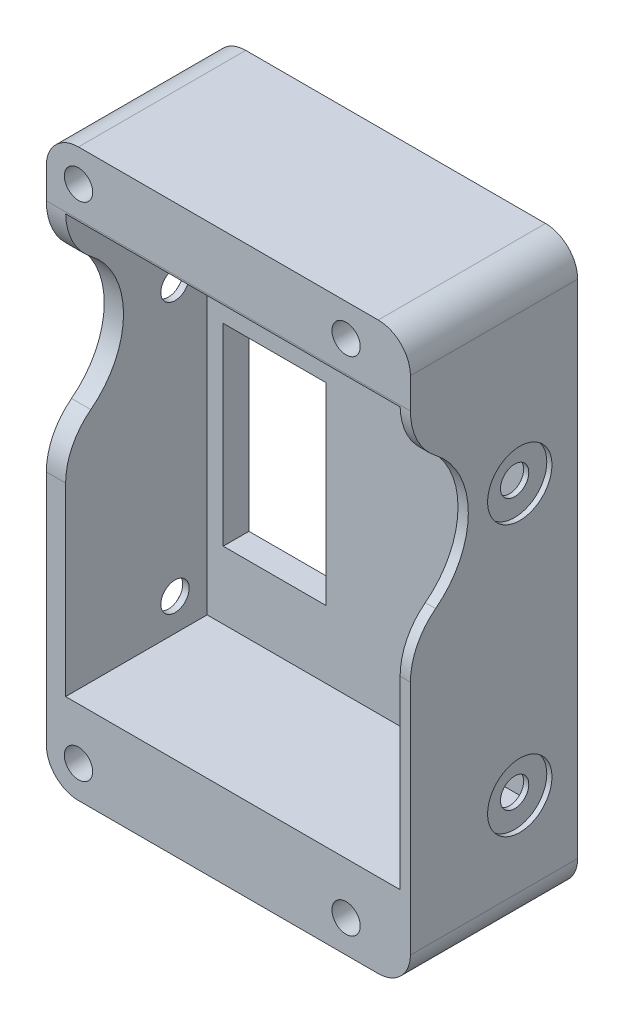
ISO-10303-21;
HEADER;
FILE_DESCRIPTION(('STEP AP214'),'2;1');
FILE_NAME('part.step','',(''),(''),'','','');
FILE_SCHEMA(('AUTOMOTIVE_DESIGN { 1 0 10303 214 1 1 1 1 }'));
ENDSEC;
DATA;
#1=APPLICATION_CONTEXT('core data for automotive mechanical design processes');
#2=APPLICATION_PROTOCOL_DEFINITION('international standard','automotive_design',2000,#1);
#3=PRODUCT_CONTEXT('',#1,'mechanical');
#4=PRODUCT('Part','Part','',(#3));
#5=PRODUCT_RELATED_PRODUCT_CATEGORY('part','',(#4));
#6=PRODUCT_DEFINITION_FORMATION('','',#4);
#7=PRODUCT_DEFINITION_CONTEXT('part definition',#1,'design');
#8=PRODUCT_DEFINITION('design','',#6,#7);
#9=PRODUCT_DEFINITION_SHAPE('','',#8);
#10=(LENGTH_UNIT() NAMED_UNIT(*) SI_UNIT(.MILLI.,.METRE.));
#11=(NAMED_UNIT(*) PLANE_ANGLE_UNIT() SI_UNIT($,.RADIAN.));
#12=(NAMED_UNIT(*) SI_UNIT($,.STERADIAN.) SOLID_ANGLE_UNIT());
#13=UNCERTAINTY_MEASURE_WITH_UNIT(LENGTH_MEASURE(1.E-05),#10,'distance_accuracy_value','');
#14=(GEOMETRIC_REPRESENTATION_CONTEXT(3) GLOBAL_UNCERTAINTY_ASSIGNED_CONTEXT((#13)) GLOBAL_UNIT_ASSIGNED_CONTEXT((#10,
#11,#12)) REPRESENTATION_CONTEXT('',''));
#15=CARTESIAN_POINT('',(0.,0.,0.));
#16=DIRECTION('',(0.,0.,1.));
#17=DIRECTION('',(1.,0.,0.));
#18=AXIS2_PLACEMENT_3D('',#15,#16,#17);
#19=CARTESIAN_POINT('',(26.8,2.5,2.50000000000001));
#20=DIRECTION('',(-1.,0.,0.));
#21=DIRECTION('',(0.,-1.,0.));
#22=AXIS2_PLACEMENT_3D('',#19,#20,#21);
#23=CYLINDRICAL_SURFACE('',#22,1.1);
#24=CARTESIAN_POINT('',(0.,2.5,2.50000000000001));
#25=DIRECTION('',(1.,0.,0.));
#26=DIRECTION('',(0.,0.,-1.));
#27=AXIS2_PLACEMENT_3D('',#24,#25,#26);
#28=CIRCLE('',#27,1.1);
#29=CARTESIAN_POINT('',(0.,2.5,1.40000000000001));
#30=VERTEX_POINT('',#29);
#31=EDGE_CURVE('E233',#30,#30,#28,.T.);
#32=ORIENTED_EDGE('',*,*,#31,.T.);
#33=EDGE_LOOP('',(#32));
#34=FACE_BOUND('',#33,.T.);
#35=CARTESIAN_POINT('',(-0.5,2.5,2.50000000000001));
#36=DIRECTION('',(-1.,0.,0.));
#37=DIRECTION('',(0.,0.,1.));
#38=AXIS2_PLACEMENT_3D('',#35,#36,#37);
#39=CIRCLE('',#38,1.1);
#40=CARTESIAN_POINT('',(-0.5,2.5,3.6));
#41=VERTEX_POINT('',#40);
#42=EDGE_CURVE('E37',#41,#41,#39,.F.);
#43=ORIENTED_EDGE('',*,*,#42,.F.);
#44=EDGE_LOOP('',(#43));
#45=FACE_BOUND('',#44,.T.);
#46=ADVANCED_FACE('F33',(#34,#45),#23,.F.);
#47=CARTESIAN_POINT('',(26.8,23.5,2.5));
#48=DIRECTION('',(-1.,0.,0.));
#49=DIRECTION('',(0.,-1.,0.));
#50=AXIS2_PLACEMENT_3D('',#47,#48,#49);
#51=CYLINDRICAL_SURFACE('',#50,1.1);
#52=CARTESIAN_POINT('',(0.,23.5,2.5));
#53=DIRECTION('',(1.,0.,0.));
#54=DIRECTION('',(0.,0.,-1.));
#55=AXIS2_PLACEMENT_3D('',#52,#53,#54);
#56=CIRCLE('',#55,1.1);
#57=CARTESIAN_POINT('',(0.,23.5,1.4));
#58=VERTEX_POINT('',#57);
#59=EDGE_CURVE('E237',#58,#58,#56,.T.);
#60=ORIENTED_EDGE('',*,*,#59,.T.);
#61=EDGE_LOOP('',(#60));
#62=FACE_BOUND('',#61,.T.);
#63=CARTESIAN_POINT('',(-0.5,23.5,2.5));
#64=DIRECTION('',(-1.,0.,0.));
#65=DIRECTION('',(0.,0.,1.));
#66=AXIS2_PLACEMENT_3D('',#63,#64,#65);
#67=CIRCLE('',#66,1.1);
#68=CARTESIAN_POINT('',(-0.5,23.5,3.6));
#69=VERTEX_POINT('',#68);
#70=EDGE_CURVE('E396',#69,#69,#67,.F.);
#71=ORIENTED_EDGE('',*,*,#70,.F.);
#72=EDGE_LOOP('',(#71));
#73=FACE_BOUND('',#72,.T.);
#74=ADVANCED_FACE('F545',(#62,#73),#51,.F.);
#75=CARTESIAN_POINT('',(26.,2.5,2.50000000000001));
#76=DIRECTION('',(-1.,0.,0.));
#77=DIRECTION('',(0.,0.,1.));
#78=AXIS2_PLACEMENT_3D('',#75,#76,#77);
#79=CIRCLE('',#78,1.1);
#80=CARTESIAN_POINT('',(26.,2.5,3.6));
#81=VERTEX_POINT('',#80);
#82=EDGE_CURVE('E232',#81,#81,#79,.T.);
#83=ORIENTED_EDGE('',*,*,#82,.T.);
#84=EDGE_LOOP('',(#83));
#85=FACE_BOUND('',#84,.T.);
#86=CARTESIAN_POINT('',(26.4,2.5,2.50000000000001));
#87=DIRECTION('',(1.,0.,0.));
#88=DIRECTION('',(0.,0.,-1.));
#89=AXIS2_PLACEMENT_3D('',#86,#87,#88);
#90=CIRCLE('',#89,1.1);
#91=CARTESIAN_POINT('',(26.4,2.5,1.40000000000001));
#92=VERTEX_POINT('',#91);
#93=EDGE_CURVE('E392',#92,#92,#90,.F.);
#94=ORIENTED_EDGE('',*,*,#93,.F.);
#95=EDGE_LOOP('',(#94));
#96=FACE_BOUND('',#95,.T.);
#97=ADVANCED_FACE('F548',(#85,#96),#23,.F.);
#98=CARTESIAN_POINT('',(26.,23.5,2.5));
#99=DIRECTION('',(-1.,0.,0.));
#100=DIRECTION('',(0.,0.,1.));
#101=AXIS2_PLACEMENT_3D('',#98,#99,#100);
#102=CIRCLE('',#101,1.1);
#103=CARTESIAN_POINT('',(26.,23.5,3.6));
#104=VERTEX_POINT('',#103);
#105=EDGE_CURVE('E236',#104,#104,#102,.T.);
#106=ORIENTED_EDGE('',*,*,#105,.T.);
#107=EDGE_LOOP('',(#106));
#108=FACE_BOUND('',#107,.T.);
#109=CARTESIAN_POINT('',(26.4,23.5,2.5));
#110=DIRECTION('',(1.,0.,0.));
#111=DIRECTION('',(0.,0.,-1.));
#112=AXIS2_PLACEMENT_3D('',#109,#110,#111);
#113=CIRCLE('',#112,1.1);
#114=CARTESIAN_POINT('',(26.4,23.5,1.4));
#115=VERTEX_POINT('',#114);
#116=EDGE_CURVE('E389',#115,#115,#113,.F.);
#117=ORIENTED_EDGE('',*,*,#116,.F.);
#118=EDGE_LOOP('',(#117));
#119=FACE_BOUND('',#118,.T.);
#120=ADVANCED_FACE('F554',(#108,#119),#51,.F.);
#121=CARTESIAN_POINT('',(1.,-4.,11.));
#122=DIRECTION('',(0.,0.,-1.));
#123=DIRECTION('',(-1.,0.,0.));
#124=AXIS2_PLACEMENT_3D('',#121,#122,#123);
#125=PLANE('',#124);
#126=CARTESIAN_POINT('',(1.,35.,11.));
#127=DIRECTION('',(0.,0.,1.));
#128=DIRECTION('',(1.,0.,0.));
#129=AXIS2_PLACEMENT_3D('',#126,#127,#128);
#130=CIRCLE('',#129,1.09999999999999);
#131=CARTESIAN_POINT('',(2.1,35.,11.));
#132=VERTEX_POINT('',#131);
#133=EDGE_CURVE('E282',#132,#132,#130,.T.);
#134=ORIENTED_EDGE('',*,*,#133,.F.);
#135=EDGE_LOOP('',(#134));
#136=FACE_BOUND('',#135,.T.);
#137=CARTESIAN_POINT('',(21.8,35.,11.));
#138=DIRECTION('',(0.,0.,1.));
#139=DIRECTION('',(1.,0.,0.));
#140=AXIS2_PLACEMENT_3D('',#137,#138,#139);
#141=CIRCLE('',#140,1.09999999999999);
#142=CARTESIAN_POINT('',(22.9,35.,11.));
#143=VERTEX_POINT('',#142);
#144=EDGE_CURVE('E285',#143,#143,#141,.T.);
#145=ORIENTED_EDGE('',*,*,#144,.F.);
#146=EDGE_LOOP('',(#145));
#147=FACE_BOUND('',#146,.T.);
#148=DIRECTION('',(0.,-1.,0.));
#149=VECTOR('',#148,1.);
#150=CARTESIAN_POINT('',(-1.5,-4.,11.));
#151=LINE('',#150,#149);
#152=CARTESIAN_POINT('',(-1.5,35.,11.));
#153=VERTEX_POINT('',#152);
#154=CARTESIAN_POINT('',(-1.5,32.6241437954473,11.));
#155=VERTEX_POINT('',#154);
#156=EDGE_CURVE('E333',#153,#155,#151,.T.);
#157=ORIENTED_EDGE('',*,*,#156,.T.);
#158=DIRECTION('',(1.,0.,0.));
#159=VECTOR('',#158,1.);
#160=CARTESIAN_POINT('',(1.,32.6241437954473,11.));
#161=LINE('',#160,#159);
#162=CARTESIAN_POINT('',(26.8,32.6241437954473,11.));
#163=VERTEX_POINT('',#162);
#164=EDGE_CURVE('E376',#155,#163,#161,.T.);
#165=ORIENTED_EDGE('',*,*,#164,.T.);
#166=DIRECTION('',(0.,1.,0.));
#167=VECTOR('',#166,1.);
#168=CARTESIAN_POINT('',(26.8,35.,11.));
#169=LINE('',#168,#167);
#170=CARTESIAN_POINT('',(26.8,35.,11.));
#171=VERTEX_POINT('',#170);
#172=EDGE_CURVE('E322',#163,#171,#169,.T.);
#173=ORIENTED_EDGE('',*,*,#172,.T.);
#174=CARTESIAN_POINT('',(24.3,35.,11.));
#175=DIRECTION('',(0.,0.,1.));
#176=DIRECTION('',(1.,0.,0.));
#177=AXIS2_PLACEMENT_3D('',#174,#175,#176);
#178=CIRCLE('',#177,2.5);
#179=CARTESIAN_POINT('',(24.3,37.5,11.));
#180=VERTEX_POINT('',#179);
#181=EDGE_CURVE('E326',#171,#180,#178,.T.);
#182=ORIENTED_EDGE('',*,*,#181,.T.);
#183=DIRECTION('',(-1.,0.,0.));
#184=VECTOR('',#183,1.);
#185=CARTESIAN_POINT('',(1.,37.5,11.));
#186=LINE('',#185,#184);
#187=CARTESIAN_POINT('',(1.,37.5,11.));
#188=VERTEX_POINT('',#187);
#189=EDGE_CURVE('E328',#180,#188,#186,.T.);
#190=ORIENTED_EDGE('',*,*,#189,.T.);
#191=CARTESIAN_POINT('',(1.,35.,11.));
#192=DIRECTION('',(0.,0.,1.));
#193=DIRECTION('',(-1.,0.,0.));
#194=AXIS2_PLACEMENT_3D('',#191,#192,#193);
#195=CIRCLE('',#194,2.5);
#196=EDGE_CURVE('E330',#188,#153,#195,.T.);
#197=ORIENTED_EDGE('',*,*,#196,.T.);
#198=EDGE_LOOP('',(#157,#165,#173,#182,#190,#197));
#199=FACE_BOUND('',#198,.T.);
#200=ADVANCED_FACE('F488',(#136,#147,#199),#125,.F.);
#201=DIRECTION('',(0.,-1.,0.));
#202=VECTOR('',#201,1.);
#203=CARTESIAN_POINT('',(0.,0.,11.));
#204=LINE('',#203,#202);
#205=CARTESIAN_POINT('',(0.,14.3758562045527,11.));
#206=VERTEX_POINT('',#205);
#207=CARTESIAN_POINT('',(0.,0.,11.));
#208=VERTEX_POINT('',#207);
#209=EDGE_CURVE('E289',#206,#208,#204,.T.);
#210=ORIENTED_EDGE('',*,*,#209,.F.);
#211=DIRECTION('',(1.,0.,0.));
#212=VECTOR('',#211,1.);
#213=CARTESIAN_POINT('',(1.,14.3758562045527,11.));
#214=LINE('',#213,#212);
#215=CARTESIAN_POINT('',(-1.5,14.3758562045527,11.));
#216=VERTEX_POINT('',#215);
#217=EDGE_CURVE('E361',#206,#216,#214,.F.);
#218=ORIENTED_EDGE('',*,*,#217,.T.);
#219=CARTESIAN_POINT('',(-1.5,-4.,11.));
#220=VERTEX_POINT('',#219);
#221=EDGE_CURVE('E332',#216,#220,#151,.T.);
#222=ORIENTED_EDGE('',*,*,#221,.T.);
#223=CARTESIAN_POINT('',(1.,-4.,11.));
#224=DIRECTION('',(0.,0.,1.));
#225=DIRECTION('',(-1.,0.,0.));
#226=AXIS2_PLACEMENT_3D('',#223,#224,#225);
#227=CIRCLE('',#226,2.5);
#228=CARTESIAN_POINT('',(1.,-6.5,11.));
#229=VERTEX_POINT('',#228);
#230=EDGE_CURVE('E315',#220,#229,#227,.T.);
#231=ORIENTED_EDGE('',*,*,#230,.T.);
#232=DIRECTION('',(1.,0.,0.));
#233=VECTOR('',#232,1.);
#234=CARTESIAN_POINT('',(24.3,-6.5,11.));
#235=LINE('',#234,#233);
#236=CARTESIAN_POINT('',(24.3,-6.5,11.));
#237=VERTEX_POINT('',#236);
#238=EDGE_CURVE('E318',#229,#237,#235,.T.);
#239=ORIENTED_EDGE('',*,*,#238,.T.);
#240=CARTESIAN_POINT('',(24.3,-4.,11.));
#241=DIRECTION('',(0.,0.,1.));
#242=DIRECTION('',(-1.,0.,0.));
#243=AXIS2_PLACEMENT_3D('',#240,#241,#242);
#244=CIRCLE('',#243,2.5);
#245=CARTESIAN_POINT('',(26.8,-4.,11.));
#246=VERTEX_POINT('',#245);
#247=EDGE_CURVE('E320',#237,#246,#244,.T.);
#248=ORIENTED_EDGE('',*,*,#247,.T.);
#249=CARTESIAN_POINT('',(26.8,14.3758562045527,11.));
#250=VERTEX_POINT('',#249);
#251=EDGE_CURVE('E323',#246,#250,#169,.T.);
#252=ORIENTED_EDGE('',*,*,#251,.T.);
#253=DIRECTION('',(1.,0.,0.));
#254=VECTOR('',#253,1.);
#255=CARTESIAN_POINT('',(1.,14.3758562045527,11.));
#256=LINE('',#255,#254);
#257=CARTESIAN_POINT('',(26.,14.3758562045527,11.));
#258=VERTEX_POINT('',#257);
#259=EDGE_CURVE('E358',#250,#258,#256,.F.);
#260=ORIENTED_EDGE('',*,*,#259,.T.);
#261=DIRECTION('',(0.,1.,0.));
#262=VECTOR('',#261,1.);
#263=CARTESIAN_POINT('',(26.,0.,11.));
#264=LINE('',#263,#262);
#265=CARTESIAN_POINT('',(26.,0.,11.));
#266=VERTEX_POINT('',#265);
#267=EDGE_CURVE('E294',#266,#258,#264,.T.);
#268=ORIENTED_EDGE('',*,*,#267,.F.);
#269=DIRECTION('',(1.,0.,0.));
#270=VECTOR('',#269,1.);
#271=CARTESIAN_POINT('',(0.,0.,11.));
#272=LINE('',#271,#270);
#273=EDGE_CURVE('E291',#208,#266,#272,.T.);
#274=ORIENTED_EDGE('',*,*,#273,.F.);
#275=EDGE_LOOP('',(#210,#218,#222,#231,#239,#248,#252,#260,#268,#274));
#276=FACE_BOUND('',#275,.T.);
#277=CARTESIAN_POINT('',(1.00000000000001,-4.,11.));
#278=DIRECTION('',(0.,0.,1.));
#279=DIRECTION('',(1.,0.,0.));
#280=AXIS2_PLACEMENT_3D('',#277,#278,#279);
#281=CIRCLE('',#280,1.1);
#282=CARTESIAN_POINT('',(2.1,-4.,11.));
#283=VERTEX_POINT('',#282);
#284=EDGE_CURVE('E279',#283,#283,#281,.T.);
#285=ORIENTED_EDGE('',*,*,#284,.F.);
#286=EDGE_LOOP('',(#285));
#287=FACE_BOUND('',#286,.T.);
#288=CARTESIAN_POINT('',(21.8,-4.,11.));
#289=DIRECTION('',(0.,0.,1.));
#290=DIRECTION('',(1.,0.,0.));
#291=AXIS2_PLACEMENT_3D('',#288,#289,#290);
#292=CIRCLE('',#291,1.1);
#293=CARTESIAN_POINT('',(22.9,-4.,11.));
#294=VERTEX_POINT('',#293);
#295=EDGE_CURVE('E276',#294,#294,#292,.T.);
#296=ORIENTED_EDGE('',*,*,#295,.F.);
#297=EDGE_LOOP('',(#296));
#298=FACE_BOUND('',#297,.T.);
#299=ADVANCED_FACE('F467',(#276,#287,#298),#125,.F.);
#300=CARTESIAN_POINT('',(1.,-4.,11.));
#301=DIRECTION('',(0.,0.,-1.));
#302=DIRECTION('',(-1.,0.,0.));
#303=AXIS2_PLACEMENT_3D('',#300,#301,#302);
#304=CYLINDRICAL_SURFACE('',#303,2.5);
#305=DIRECTION('',(0.,0.,-1.));
#306=VECTOR('',#305,1.);
#307=CARTESIAN_POINT('',(-1.5,-4.,11.));
#308=LINE('',#307,#306);
#309=CARTESIAN_POINT('',(-1.5,-4.,-2.));
#310=VERTEX_POINT('',#309);
#311=EDGE_CURVE('E336',#220,#310,#308,.T.);
#312=ORIENTED_EDGE('',*,*,#311,.T.);
#313=CARTESIAN_POINT('',(1.,-4.,-2.));
#314=DIRECTION('',(0.,0.,-1.));
#315=DIRECTION('',(-1.,0.,0.));
#316=AXIS2_PLACEMENT_3D('',#313,#314,#315);
#317=CIRCLE('',#316,2.5);
#318=CARTESIAN_POINT('',(1.,-6.5,-2.));
#319=VERTEX_POINT('',#318);
#320=EDGE_CURVE('E252',#319,#310,#317,.T.);
#321=ORIENTED_EDGE('',*,*,#320,.F.);
#322=DIRECTION('',(0.,0.,-1.));
#323=VECTOR('',#322,1.);
#324=CARTESIAN_POINT('',(1.,-6.5,11.));
#325=LINE('',#324,#323);
#326=EDGE_CURVE('E350',#229,#319,#325,.T.);
#327=ORIENTED_EDGE('',*,*,#326,.F.);
#328=ORIENTED_EDGE('',*,*,#230,.F.);
#329=EDGE_LOOP('',(#312,#321,#327,#328));
#330=FACE_BOUND('',#329,.T.);
#331=ADVANCED_FACE('F509',(#330),#304,.T.);
#332=CARTESIAN_POINT('',(24.3,-6.5,11.));
#333=DIRECTION('',(0.,1.,0.));
#334=DIRECTION('',(-1.,0.,0.));
#335=AXIS2_PLACEMENT_3D('',#332,#333,#334);
#336=PLANE('',#335);
#337=ORIENTED_EDGE('',*,*,#326,.T.);
#338=DIRECTION('',(-1.,0.,0.));
#339=VECTOR('',#338,1.);
#340=CARTESIAN_POINT('',(24.3,-6.5,-2.));
#341=LINE('',#340,#339);
#342=CARTESIAN_POINT('',(24.3,-6.5,-2.));
#343=VERTEX_POINT('',#342);
#344=EDGE_CURVE('E273',#343,#319,#341,.T.);
#345=ORIENTED_EDGE('',*,*,#344,.F.);
#346=DIRECTION('',(0.,0.,-1.));
#347=VECTOR('',#346,1.);
#348=CARTESIAN_POINT('',(24.3,-6.5,11.));
#349=LINE('',#348,#347);
#350=EDGE_CURVE('E348',#237,#343,#349,.T.);
#351=ORIENTED_EDGE('',*,*,#350,.F.);
#352=ORIENTED_EDGE('',*,*,#238,.F.);
#353=EDGE_LOOP('',(#337,#345,#351,#352));
#354=FACE_BOUND('',#353,.T.);
#355=ADVANCED_FACE('F515',(#354),#336,.F.);
#356=CARTESIAN_POINT('',(24.3,-4.,11.));
#357=DIRECTION('',(0.,0.,-1.));
#358=DIRECTION('',(-1.,0.,0.));
#359=AXIS2_PLACEMENT_3D('',#356,#357,#358);
#360=CYLINDRICAL_SURFACE('',#359,2.5);
#361=ORIENTED_EDGE('',*,*,#350,.T.);
#362=CARTESIAN_POINT('',(24.3,-4.,-2.));
#363=DIRECTION('',(0.,0.,-1.));
#364=DIRECTION('',(-1.,0.,0.));
#365=AXIS2_PLACEMENT_3D('',#362,#363,#364);
#366=CIRCLE('',#365,2.5);
#367=CARTESIAN_POINT('',(26.8,-4.,-2.));
#368=VERTEX_POINT('',#367);
#369=EDGE_CURVE('E270',#368,#343,#366,.T.);
#370=ORIENTED_EDGE('',*,*,#369,.F.);
#371=DIRECTION('',(0.,0.,-1.));
#372=VECTOR('',#371,1.);
#373=CARTESIAN_POINT('',(26.8,-4.,11.));
#374=LINE('',#373,#372);
#375=EDGE_CURVE('E346',#246,#368,#374,.T.);
#376=ORIENTED_EDGE('',*,*,#375,.F.);
#377=ORIENTED_EDGE('',*,*,#247,.F.);
#378=EDGE_LOOP('',(#361,#370,#376,#377));
#379=FACE_BOUND('',#378,.T.);
#380=ADVANCED_FACE('F518',(#379),#360,.T.);
#381=CARTESIAN_POINT('',(26.8,35.,11.));
#382=DIRECTION('',(-1.,0.,0.));
#383=DIRECTION('',(0.,0.,1.));
#384=AXIS2_PLACEMENT_3D('',#381,#382,#383);
#385=PLANE('',#384);
#386=CARTESIAN_POINT('',(26.8,2.5,2.50000000000001));
#387=DIRECTION('',(1.,0.,0.));
#388=DIRECTION('',(0.,0.,-1.));
#389=AXIS2_PLACEMENT_3D('',#386,#387,#388);
#390=CIRCLE('',#389,2.5);
#391=CARTESIAN_POINT('',(26.8,2.5,0.));
#392=VERTEX_POINT('',#391);
#393=EDGE_CURVE('E419',#392,#392,#390,.T.);
#394=ORIENTED_EDGE('',*,*,#393,.F.);
#395=EDGE_LOOP('',(#394));
#396=FACE_BOUND('',#395,.T.);
#397=CARTESIAN_POINT('',(26.8,23.5,2.5));
#398=DIRECTION('',(1.,0.,0.));
#399=DIRECTION('',(0.,0.,-1.));
#400=AXIS2_PLACEMENT_3D('',#397,#398,#399);
#401=CIRCLE('',#400,2.5);
#402=CARTESIAN_POINT('',(26.8,23.5,0.));
#403=VERTEX_POINT('',#402);
#404=EDGE_CURVE('E402',#403,#403,#401,.T.);
#405=ORIENTED_EDGE('',*,*,#404,.F.);
#406=EDGE_LOOP('',(#405));
#407=FACE_BOUND('',#406,.T.);
#408=ORIENTED_EDGE('',*,*,#172,.F.);
#409=CARTESIAN_POINT('',(26.8,32.6241437954473,6.));
#410=DIRECTION('',(-1.,0.,0.));
#411=DIRECTION('',(0.,0.,1.));
#412=AXIS2_PLACEMENT_3D('',#409,#410,#411);
#413=CIRCLE('',#412,5.);
#414=CARTESIAN_POINT('',(26.8,28.6571247539485,9.04347826086956));
#415=VERTEX_POINT('',#414);
#416=EDGE_CURVE('E381',#163,#415,#413,.F.);
#417=ORIENTED_EDGE('',*,*,#416,.T.);
#418=CARTESIAN_POINT('',(26.8,23.5,13.));
#419=DIRECTION('',(1.,0.,0.));
#420=DIRECTION('',(0.,0.,-1.));
#421=AXIS2_PLACEMENT_3D('',#418,#419,#420);
#422=CIRCLE('',#421,6.5);
#423=CARTESIAN_POINT('',(26.8,18.3428752460515,9.04347826086956));
#424=VERTEX_POINT('',#423);
#425=EDGE_CURVE('E395',#424,#415,#422,.T.);
#426=ORIENTED_EDGE('',*,*,#425,.F.);
#427=CARTESIAN_POINT('',(26.8,14.3758562045527,6.));
#428=DIRECTION('',(-1.,0.,0.));
#429=DIRECTION('',(0.,0.,1.));
#430=AXIS2_PLACEMENT_3D('',#427,#428,#429);
#431=CIRCLE('',#430,5.);
#432=EDGE_CURVE('E379',#424,#250,#431,.F.);
#433=ORIENTED_EDGE('',*,*,#432,.T.);
#434=ORIENTED_EDGE('',*,*,#251,.F.);
#435=ORIENTED_EDGE('',*,*,#375,.T.);
#436=DIRECTION('',(0.,-1.,0.));
#437=VECTOR('',#436,1.);
#438=CARTESIAN_POINT('',(26.8,35.,-2.));
#439=LINE('',#438,#437);
#440=CARTESIAN_POINT('',(26.8,35.,-2.));
#441=VERTEX_POINT('',#440);
#442=EDGE_CURVE('E267',#441,#368,#439,.T.);
#443=ORIENTED_EDGE('',*,*,#442,.F.);
#444=DIRECTION('',(0.,0.,-1.));
#445=VECTOR('',#444,1.);
#446=CARTESIAN_POINT('',(26.8,35.,11.));
#447=LINE('',#446,#445);
#448=EDGE_CURVE('E344',#171,#441,#447,.T.);
#449=ORIENTED_EDGE('',*,*,#448,.F.);
#450=EDGE_LOOP('',(#408,#417,#426,#433,#434,#435,#443,#449));
#451=FACE_BOUND('',#450,.T.);
#452=ADVANCED_FACE('F481',(#396,#407,#451),#385,.F.);
#453=CARTESIAN_POINT('',(24.3,35.,11.));
#454=DIRECTION('',(0.,0.,-1.));
#455=DIRECTION('',(-1.,0.,0.));
#456=AXIS2_PLACEMENT_3D('',#453,#454,#455);
#457=CYLINDRICAL_SURFACE('',#456,2.5);
#458=ORIENTED_EDGE('',*,*,#448,.T.);
#459=CARTESIAN_POINT('',(24.3,35.,-2.));
#460=DIRECTION('',(0.,0.,-1.));
#461=DIRECTION('',(-1.,0.,0.));
#462=AXIS2_PLACEMENT_3D('',#459,#460,#461);
#463=CIRCLE('',#462,2.5);
#464=CARTESIAN_POINT('',(24.3,37.5,-2.));
#465=VERTEX_POINT('',#464);
#466=EDGE_CURVE('E264',#465,#441,#463,.T.);
#467=ORIENTED_EDGE('',*,*,#466,.F.);
#468=DIRECTION('',(0.,0.,-1.));
#469=VECTOR('',#468,1.);
#470=CARTESIAN_POINT('',(24.3,37.5,11.));
#471=LINE('',#470,#469);
#472=EDGE_CURVE('E342',#180,#465,#471,.T.);
#473=ORIENTED_EDGE('',*,*,#472,.F.);
#474=ORIENTED_EDGE('',*,*,#181,.F.);
#475=EDGE_LOOP('',(#458,#467,#473,#474));
#476=FACE_BOUND('',#475,.T.);
#477=ADVANCED_FACE('F526',(#476),#457,.T.);
#478=CARTESIAN_POINT('',(1.,37.5,11.));
#479=DIRECTION('',(0.,-1.,0.));
#480=DIRECTION('',(0.,0.,-1.));
#481=AXIS2_PLACEMENT_3D('',#478,#479,#480);
#482=PLANE('',#481);
#483=ORIENTED_EDGE('',*,*,#472,.T.);
#484=DIRECTION('',(1.,0.,0.));
#485=VECTOR('',#484,1.);
#486=CARTESIAN_POINT('',(1.,37.5,-2.));
#487=LINE('',#486,#485);
#488=CARTESIAN_POINT('',(1.,37.5,-2.));
#489=VERTEX_POINT('',#488);
#490=EDGE_CURVE('E261',#489,#465,#487,.T.);
#491=ORIENTED_EDGE('',*,*,#490,.F.);
#492=DIRECTION('',(0.,0.,-1.));
#493=VECTOR('',#492,1.);
#494=CARTESIAN_POINT('',(1.,37.5,11.));
#495=LINE('',#494,#493);
#496=EDGE_CURVE('E340',#188,#489,#495,.T.);
#497=ORIENTED_EDGE('',*,*,#496,.F.);
#498=ORIENTED_EDGE('',*,*,#189,.F.);
#499=EDGE_LOOP('',(#483,#491,#497,#498));
#500=FACE_BOUND('',#499,.T.);
#501=ADVANCED_FACE('F531',(#500),#482,.F.);
#502=CARTESIAN_POINT('',(1.,35.,11.));
#503=DIRECTION('',(0.,0.,-1.));
#504=DIRECTION('',(-1.,0.,0.));
#505=AXIS2_PLACEMENT_3D('',#502,#503,#504);
#506=CYLINDRICAL_SURFACE('',#505,2.5);
#507=ORIENTED_EDGE('',*,*,#496,.T.);
#508=CARTESIAN_POINT('',(1.,35.,-2.));
#509=DIRECTION('',(0.,0.,-1.));
#510=DIRECTION('',(-1.,0.,0.));
#511=AXIS2_PLACEMENT_3D('',#508,#509,#510);
#512=CIRCLE('',#511,2.5);
#513=CARTESIAN_POINT('',(-1.5,35.,-2.));
#514=VERTEX_POINT('',#513);
#515=EDGE_CURVE('E258',#514,#489,#512,.T.);
#516=ORIENTED_EDGE('',*,*,#515,.F.);
#517=DIRECTION('',(0.,0.,-1.));
#518=VECTOR('',#517,1.);
#519=CARTESIAN_POINT('',(-1.5,35.,11.));
#520=LINE('',#519,#518);
#521=EDGE_CURVE('E338',#153,#514,#520,.T.);
#522=ORIENTED_EDGE('',*,*,#521,.F.);
#523=ORIENTED_EDGE('',*,*,#196,.F.);
#524=EDGE_LOOP('',(#507,#516,#522,#523));
#525=FACE_BOUND('',#524,.T.);
#526=ADVANCED_FACE('F534',(#525),#506,.T.);
#527=CARTESIAN_POINT('',(-1.5,-4.,11.));
#528=DIRECTION('',(1.,0.,0.));
#529=DIRECTION('',(0.,0.,-1.));
#530=AXIS2_PLACEMENT_3D('',#527,#528,#529);
#531=PLANE('',#530);
#532=CARTESIAN_POINT('',(-1.5,2.5,2.50000000000001));
#533=DIRECTION('',(-1.,0.,0.));
#534=DIRECTION('',(0.,0.,1.));
#535=AXIS2_PLACEMENT_3D('',#532,#533,#534);
#536=CIRCLE('',#535,2.5);
#537=CARTESIAN_POINT('',(-1.5,2.5,5.00000000000001));
#538=VERTEX_POINT('',#537);
#539=EDGE_CURVE('E404',#538,#538,#536,.T.);
#540=ORIENTED_EDGE('',*,*,#539,.F.);
#541=EDGE_LOOP('',(#540));
#542=FACE_BOUND('',#541,.T.);
#543=CARTESIAN_POINT('',(-1.5,23.5,2.5));
#544=DIRECTION('',(-1.,0.,0.));
#545=DIRECTION('',(0.,0.,1.));
#546=AXIS2_PLACEMENT_3D('',#543,#544,#545);
#547=CIRCLE('',#546,2.5);
#548=CARTESIAN_POINT('',(-1.5,23.5,5.));
#549=VERTEX_POINT('',#548);
#550=EDGE_CURVE('E414',#549,#549,#547,.T.);
#551=ORIENTED_EDGE('',*,*,#550,.F.);
#552=EDGE_LOOP('',(#551));
#553=FACE_BOUND('',#552,.T.);
#554=ORIENTED_EDGE('',*,*,#221,.F.);
#555=CARTESIAN_POINT('',(-1.5,14.3758562045527,6.));
#556=DIRECTION('',(1.,0.,0.));
#557=DIRECTION('',(0.,0.,-1.));
#558=AXIS2_PLACEMENT_3D('',#555,#556,#557);
#559=CIRCLE('',#558,5.);
#560=CARTESIAN_POINT('',(-1.5,18.3428752460515,9.04347826086956));
#561=VERTEX_POINT('',#560);
#562=EDGE_CURVE('E366',#216,#561,#559,.F.);
#563=ORIENTED_EDGE('',*,*,#562,.T.);
#564=CARTESIAN_POINT('',(-1.5,23.5,13.));
#565=DIRECTION('',(1.,0.,0.));
#566=DIRECTION('',(0.,0.,-1.));
#567=AXIS2_PLACEMENT_3D('',#564,#565,#566);
#568=CIRCLE('',#567,6.5);
#569=CARTESIAN_POINT('',(-1.5,28.6571247539485,9.04347826086956));
#570=VERTEX_POINT('',#569);
#571=EDGE_CURVE('E427',#561,#570,#568,.T.);
#572=ORIENTED_EDGE('',*,*,#571,.T.);
#573=CARTESIAN_POINT('',(-1.5,32.6241437954473,6.));
#574=DIRECTION('',(1.,0.,0.));
#575=DIRECTION('',(0.,0.,-1.));
#576=AXIS2_PLACEMENT_3D('',#573,#574,#575);
#577=CIRCLE('',#576,5.);
#578=EDGE_CURVE('E364',#570,#155,#577,.F.);
#579=ORIENTED_EDGE('',*,*,#578,.T.);
#580=ORIENTED_EDGE('',*,*,#156,.F.);
#581=ORIENTED_EDGE('',*,*,#521,.T.);
#582=DIRECTION('',(0.,1.,0.));
#583=VECTOR('',#582,1.);
#584=CARTESIAN_POINT('',(-1.5,-4.,-2.));
#585=LINE('',#584,#583);
#586=EDGE_CURVE('E255',#310,#514,#585,.T.);
#587=ORIENTED_EDGE('',*,*,#586,.F.);
#588=ORIENTED_EDGE('',*,*,#311,.F.);
#589=EDGE_LOOP('',(#554,#563,#572,#579,#580,#581,#587,#588));
#590=FACE_BOUND('',#589,.T.);
#591=ADVANCED_FACE('F494',(#542,#553,#590),#531,.F.);
#592=CARTESIAN_POINT('',(0.,0.,11.));
#593=DIRECTION('',(1.,0.,0.));
#594=DIRECTION('',(0.,0.,-1.));
#595=AXIS2_PLACEMENT_3D('',#592,#593,#594);
#596=PLANE('',#595);
#597=CARTESIAN_POINT('',(0.,23.5,13.));
#598=DIRECTION('',(1.,0.,0.));
#599=DIRECTION('',(0.,0.,-1.));
#600=AXIS2_PLACEMENT_3D('',#597,#598,#599);
#601=CIRCLE('',#600,6.5);
#602=CARTESIAN_POINT('',(0.,18.3428752460515,9.04347826086956));
#603=VERTEX_POINT('',#602);
#604=CARTESIAN_POINT('',(0.,28.6571247539485,9.04347826086956));
#605=VERTEX_POINT('',#604);
#606=EDGE_CURVE('E430',#603,#605,#601,.T.);
#607=ORIENTED_EDGE('',*,*,#606,.F.);
#608=CARTESIAN_POINT('',(0.,14.3758562045527,6.));
#609=DIRECTION('',(1.,0.,0.));
#610=DIRECTION('',(0.,0.,-1.));
#611=AXIS2_PLACEMENT_3D('',#608,#609,#610);
#612=CIRCLE('',#611,5.);
#613=EDGE_CURVE('E374',#603,#206,#612,.T.);
#614=ORIENTED_EDGE('',*,*,#613,.T.);
#615=ORIENTED_EDGE('',*,*,#209,.T.);
#616=DIRECTION('',(0.,0.,-1.));
#617=VECTOR('',#616,1.);
#618=CARTESIAN_POINT('',(0.,0.,11.));
#619=LINE('',#618,#617);
#620=CARTESIAN_POINT('',(0.,0.,0.));
#621=VERTEX_POINT('',#620);
#622=EDGE_CURVE('E312',#208,#621,#619,.T.);
#623=ORIENTED_EDGE('',*,*,#622,.T.);
#624=DIRECTION('',(0.,-1.,0.));
#625=VECTOR('',#624,1.);
#626=CARTESIAN_POINT('',(0.,0.,0.));
#627=LINE('',#626,#625);
#628=CARTESIAN_POINT('',(0.,32.5,0.));
#629=VERTEX_POINT('',#628);
#630=EDGE_CURVE('E288',#629,#621,#627,.T.);
#631=ORIENTED_EDGE('',*,*,#630,.F.);
#632=DIRECTION('',(0.,0.,-1.));
#633=VECTOR('',#632,1.);
#634=CARTESIAN_POINT('',(0.,32.5,11.));
#635=LINE('',#634,#633);
#636=CARTESIAN_POINT('',(0.,32.5,10.998458594212));
#637=VERTEX_POINT('',#636);
#638=EDGE_CURVE('E296',#637,#629,#635,.T.);
#639=ORIENTED_EDGE('',*,*,#638,.F.);
#640=CARTESIAN_POINT('',(0.,32.6241437954473,6.));
#641=DIRECTION('',(1.,0.,0.));
#642=DIRECTION('',(0.,0.,-1.));
#643=AXIS2_PLACEMENT_3D('',#640,#641,#642);
#644=CIRCLE('',#643,5.);
#645=EDGE_CURVE('E372',#637,#605,#644,.T.);
#646=ORIENTED_EDGE('',*,*,#645,.T.);
#647=EDGE_LOOP('',(#607,#614,#615,#623,#631,#639,#646));
#648=FACE_BOUND('',#647,.T.);
#649=ORIENTED_EDGE('',*,*,#59,.F.);
#650=EDGE_LOOP('',(#649));
#651=FACE_BOUND('',#650,.T.);
#652=ORIENTED_EDGE('',*,*,#31,.F.);
#653=EDGE_LOOP('',(#652));
#654=FACE_BOUND('',#653,.T.);
#655=ADVANCED_FACE('F459',(#648,#651,#654),#596,.T.);
#656=CARTESIAN_POINT('',(0.,0.,11.));
#657=DIRECTION('',(0.,1.,0.));
#658=DIRECTION('',(0.,0.,1.));
#659=AXIS2_PLACEMENT_3D('',#656,#657,#658);
#660=PLANE('',#659);
#661=DIRECTION('',(1.,0.,0.));
#662=VECTOR('',#661,1.);
#663=CARTESIAN_POINT('',(0.,0.,0.));
#664=LINE('',#663,#662);
#665=CARTESIAN_POINT('',(26.,0.,0.));
#666=VERTEX_POINT('',#665);
#667=EDGE_CURVE('E299',#621,#666,#664,.T.);
#668=ORIENTED_EDGE('',*,*,#667,.F.);
#669=ORIENTED_EDGE('',*,*,#622,.F.);
#670=ORIENTED_EDGE('',*,*,#273,.T.);
#671=DIRECTION('',(0.,0.,-1.));
#672=VECTOR('',#671,1.);
#673=CARTESIAN_POINT('',(26.,0.,11.));
#674=LINE('',#673,#672);
#675=EDGE_CURVE('E310',#266,#666,#674,.T.);
#676=ORIENTED_EDGE('',*,*,#675,.T.);
#677=EDGE_LOOP('',(#668,#669,#670,#676));
#678=FACE_BOUND('',#677,.T.);
#679=ADVANCED_FACE('F465',(#678),#660,.T.);
#680=CARTESIAN_POINT('',(26.,0.,11.));
#681=DIRECTION('',(-1.,0.,0.));
#682=DIRECTION('',(0.,0.,1.));
#683=AXIS2_PLACEMENT_3D('',#680,#681,#682);
#684=PLANE('',#683);
#685=CARTESIAN_POINT('',(26.,23.5,13.));
#686=DIRECTION('',(-1.,0.,0.));
#687=DIRECTION('',(0.,0.,1.));
#688=AXIS2_PLACEMENT_3D('',#685,#686,#687);
#689=CIRCLE('',#688,6.5);
#690=CARTESIAN_POINT('',(26.,28.6571247539485,9.04347826086956));
#691=VERTEX_POINT('',#690);
#692=CARTESIAN_POINT('',(26.,18.3428752460515,9.04347826086956));
#693=VERTEX_POINT('',#692);
#694=EDGE_CURVE('E352',#691,#693,#689,.T.);
#695=ORIENTED_EDGE('',*,*,#694,.F.);
#696=CARTESIAN_POINT('',(26.,32.6241437954473,6.));
#697=DIRECTION('',(-1.,0.,0.));
#698=DIRECTION('',(0.,0.,1.));
#699=AXIS2_PLACEMENT_3D('',#696,#697,#698);
#700=CIRCLE('',#699,5.);
#701=CARTESIAN_POINT('',(26.,32.5,10.998458594212));
#702=VERTEX_POINT('',#701);
#703=EDGE_CURVE('E42',#691,#702,#700,.T.);
#704=ORIENTED_EDGE('',*,*,#703,.T.);
#705=DIRECTION('',(0.,0.,-1.));
#706=VECTOR('',#705,1.);
#707=CARTESIAN_POINT('',(26.,32.5,11.));
#708=LINE('',#707,#706);
#709=CARTESIAN_POINT('',(26.,32.5,0.));
#710=VERTEX_POINT('',#709);
#711=EDGE_CURVE('E308',#702,#710,#708,.T.);
#712=ORIENTED_EDGE('',*,*,#711,.T.);
#713=DIRECTION('',(0.,1.,0.));
#714=VECTOR('',#713,1.);
#715=CARTESIAN_POINT('',(26.,0.,0.));
#716=LINE('',#715,#714);
#717=EDGE_CURVE('E302',#666,#710,#716,.T.);
#718=ORIENTED_EDGE('',*,*,#717,.F.);
#719=ORIENTED_EDGE('',*,*,#675,.F.);
#720=ORIENTED_EDGE('',*,*,#267,.T.);
#721=CARTESIAN_POINT('',(26.,14.3758562045527,6.));
#722=DIRECTION('',(-1.,0.,0.));
#723=DIRECTION('',(0.,0.,1.));
#724=AXIS2_PLACEMENT_3D('',#721,#722,#723);
#725=CIRCLE('',#724,5.);
#726=EDGE_CURVE('E55',#258,#693,#725,.T.);
#727=ORIENTED_EDGE('',*,*,#726,.T.);
#728=EDGE_LOOP('',(#695,#704,#712,#718,#719,#720,#727));
#729=FACE_BOUND('',#728,.T.);
#730=ORIENTED_EDGE('',*,*,#105,.F.);
#731=EDGE_LOOP('',(#730));
#732=FACE_BOUND('',#731,.T.);
#733=ORIENTED_EDGE('',*,*,#82,.F.);
#734=EDGE_LOOP('',(#733));
#735=FACE_BOUND('',#734,.T.);
#736=ADVANCED_FACE('F448',(#729,#732,#735),#684,.T.);
#737=CARTESIAN_POINT('',(0.,32.5,11.));
#738=DIRECTION('',(0.,-1.,0.));
#739=DIRECTION('',(0.,0.,-1.));
#740=AXIS2_PLACEMENT_3D('',#737,#738,#739);
#741=PLANE('',#740);
#742=ORIENTED_EDGE('',*,*,#711,.F.);
#743=DIRECTION('',(1.,0.,0.));
#744=VECTOR('',#743,1.);
#745=CARTESIAN_POINT('',(26.,32.5,10.998458594212));
#746=LINE('',#745,#744);
#747=EDGE_CURVE('E11',#702,#637,#746,.F.);
#748=ORIENTED_EDGE('',*,*,#747,.T.);
#749=ORIENTED_EDGE('',*,*,#638,.T.);
#750=DIRECTION('',(-1.,0.,0.));
#751=VECTOR('',#750,1.);
#752=CARTESIAN_POINT('',(0.,32.5,0.));
#753=LINE('',#752,#751);
#754=EDGE_CURVE('E292',#710,#629,#753,.T.);
#755=ORIENTED_EDGE('',*,*,#754,.F.);
#756=EDGE_LOOP('',(#742,#748,#749,#755));
#757=FACE_BOUND('',#756,.T.);
#758=ADVANCED_FACE('F453',(#757),#741,.T.);
#759=CARTESIAN_POINT('',(21.8,35.,11.));
#760=DIRECTION('',(0.,0.,-1.));
#761=DIRECTION('',(-1.,0.,0.));
#762=AXIS2_PLACEMENT_3D('',#759,#760,#761);
#763=CYLINDRICAL_SURFACE('',#762,1.09999999999999);
#764=ORIENTED_EDGE('',*,*,#144,.T.);
#765=EDGE_LOOP('',(#764));
#766=FACE_BOUND('',#765,.T.);
#767=CARTESIAN_POINT('',(21.8,35.,-2.));
#768=DIRECTION('',(0.,0.,-1.));
#769=DIRECTION('',(-1.,0.,0.));
#770=AXIS2_PLACEMENT_3D('',#767,#768,#769);
#771=CIRCLE('',#770,1.09999999999999);
#772=CARTESIAN_POINT('',(20.7,35.,-2.));
#773=VERTEX_POINT('',#772);
#774=EDGE_CURVE('E240',#773,#773,#771,.T.);
#775=ORIENTED_EDGE('',*,*,#774,.T.);
#776=EDGE_LOOP('',(#775));
#777=FACE_BOUND('',#776,.T.);
#778=ADVANCED_FACE('F615',(#766,#777),#763,.F.);
#779=CARTESIAN_POINT('',(1.,35.,11.));
#780=DIRECTION('',(0.,0.,-1.));
#781=DIRECTION('',(-1.,0.,0.));
#782=AXIS2_PLACEMENT_3D('',#779,#780,#781);
#783=CYLINDRICAL_SURFACE('',#782,1.09999999999999);
#784=ORIENTED_EDGE('',*,*,#133,.T.);
#785=EDGE_LOOP('',(#784));
#786=FACE_BOUND('',#785,.T.);
#787=CARTESIAN_POINT('',(1.,35.,-2.));
#788=DIRECTION('',(0.,0.,-1.));
#789=DIRECTION('',(-1.,0.,0.));
#790=AXIS2_PLACEMENT_3D('',#787,#788,#789);
#791=CIRCLE('',#790,1.1);
#792=CARTESIAN_POINT('',(-0.0999999999999951,35.,-2.));
#793=VERTEX_POINT('',#792);
#794=EDGE_CURVE('E243',#793,#793,#791,.T.);
#795=ORIENTED_EDGE('',*,*,#794,.T.);
#796=EDGE_LOOP('',(#795));
#797=FACE_BOUND('',#796,.T.);
#798=ADVANCED_FACE('F611',(#786,#797),#783,.F.);
#799=CARTESIAN_POINT('',(1.00000000000001,-4.,11.));
#800=DIRECTION('',(0.,0.,-1.));
#801=DIRECTION('',(-1.,0.,0.));
#802=AXIS2_PLACEMENT_3D('',#799,#800,#801);
#803=CYLINDRICAL_SURFACE('',#802,1.1);
#804=ORIENTED_EDGE('',*,*,#284,.T.);
#805=EDGE_LOOP('',(#804));
#806=FACE_BOUND('',#805,.T.);
#807=CARTESIAN_POINT('',(1.00000000000001,-4.,-2.));
#808=DIRECTION('',(0.,0.,-1.));
#809=DIRECTION('',(-1.,0.,0.));
#810=AXIS2_PLACEMENT_3D('',#807,#808,#809);
#811=CIRCLE('',#810,1.1);
#812=CARTESIAN_POINT('',(-0.0999999999999951,-4.,-2.));
#813=VERTEX_POINT('',#812);
#814=EDGE_CURVE('E246',#813,#813,#811,.T.);
#815=ORIENTED_EDGE('',*,*,#814,.T.);
#816=EDGE_LOOP('',(#815));
#817=FACE_BOUND('',#816,.T.);
#818=ADVANCED_FACE('F607',(#806,#817),#803,.F.);
#819=CARTESIAN_POINT('',(21.8,-4.,11.));
#820=DIRECTION('',(0.,0.,-1.));
#821=DIRECTION('',(-1.,0.,0.));
#822=AXIS2_PLACEMENT_3D('',#819,#820,#821);
#823=CYLINDRICAL_SURFACE('',#822,1.1);
#824=ORIENTED_EDGE('',*,*,#295,.T.);
#825=EDGE_LOOP('',(#824));
#826=FACE_BOUND('',#825,.T.);
#827=CARTESIAN_POINT('',(21.8,-4.,-2.));
#828=DIRECTION('',(0.,0.,-1.));
#829=DIRECTION('',(-1.,0.,0.));
#830=AXIS2_PLACEMENT_3D('',#827,#828,#829);
#831=CIRCLE('',#830,1.1);
#832=CARTESIAN_POINT('',(20.7,-4.,-2.));
#833=VERTEX_POINT('',#832);
#834=EDGE_CURVE('E249',#833,#833,#831,.T.);
#835=ORIENTED_EDGE('',*,*,#834,.T.);
#836=EDGE_LOOP('',(#835));
#837=FACE_BOUND('',#836,.T.);
#838=ADVANCED_FACE('F443',(#826,#837),#823,.F.);
#839=CARTESIAN_POINT('',(1.,-4.,0.));
#840=DIRECTION('',(0.,0.,-1.));
#841=DIRECTION('',(-1.,0.,0.));
#842=AXIS2_PLACEMENT_3D('',#839,#840,#841);
#843=PLANE('',#842);
#844=DIRECTION('',(-1.,0.,0.));
#845=VECTOR('',#844,1.);
#846=CARTESIAN_POINT('',(1.,5.25000000000001,0.));
#847=LINE('',#846,#845);
#848=CARTESIAN_POINT('',(9.25,5.25,0.));
#849=VERTEX_POINT('',#848);
#850=CARTESIAN_POINT('',(1.25,5.25,0.));
#851=VERTEX_POINT('',#850);
#852=EDGE_CURVE('E226',#849,#851,#847,.T.);
#853=ORIENTED_EDGE('',*,*,#852,.T.);
#854=DIRECTION('',(0.,1.,0.));
#855=VECTOR('',#854,1.);
#856=CARTESIAN_POINT('',(1.25,-4.,0.));
#857=LINE('',#856,#855);
#858=CARTESIAN_POINT('',(1.25,20.25,0.));
#859=VERTEX_POINT('',#858);
#860=EDGE_CURVE('E229',#851,#859,#857,.T.);
#861=ORIENTED_EDGE('',*,*,#860,.T.);
#862=DIRECTION('',(1.,0.,0.));
#863=VECTOR('',#862,1.);
#864=CARTESIAN_POINT('',(1.,20.25,0.));
#865=LINE('',#864,#863);
#866=CARTESIAN_POINT('',(9.25,20.25,0.));
#867=VERTEX_POINT('',#866);
#868=EDGE_CURVE('E221',#859,#867,#865,.T.);
#869=ORIENTED_EDGE('',*,*,#868,.T.);
#870=DIRECTION('',(0.,-1.,0.));
#871=VECTOR('',#870,1.);
#872=CARTESIAN_POINT('',(9.25,-4.,0.));
#873=LINE('',#872,#871);
#874=EDGE_CURVE('E196',#867,#849,#873,.T.);
#875=ORIENTED_EDGE('',*,*,#874,.T.);
#876=EDGE_LOOP('',(#853,#861,#869,#875));
#877=FACE_BOUND('',#876,.T.);
#878=ORIENTED_EDGE('',*,*,#717,.T.);
#879=ORIENTED_EDGE('',*,*,#754,.T.);
#880=ORIENTED_EDGE('',*,*,#630,.T.);
#881=ORIENTED_EDGE('',*,*,#667,.T.);
#882=EDGE_LOOP('',(#878,#879,#880,#881));
#883=FACE_BOUND('',#882,.T.);
#884=ADVANCED_FACE('F440',(#877,#883),#843,.F.);
#885=CARTESIAN_POINT('',(1.,-4.,-2.));
#886=DIRECTION('',(0.,0.,-1.));
#887=DIRECTION('',(-1.,0.,0.));
#888=AXIS2_PLACEMENT_3D('',#885,#886,#887);
#889=PLANE('',#888);
#890=DIRECTION('',(0.,1.,0.));
#891=VECTOR('',#890,1.);
#892=CARTESIAN_POINT('',(1.25,5.25,-2.));
#893=LINE('',#892,#891);
#894=CARTESIAN_POINT('',(1.25,5.25,-2.));
#895=VERTEX_POINT('',#894);
#896=CARTESIAN_POINT('',(1.25,20.25,-2.));
#897=VERTEX_POINT('',#896);
#898=EDGE_CURVE('E209',#895,#897,#893,.T.);
#899=ORIENTED_EDGE('',*,*,#898,.F.);
#900=DIRECTION('',(-1.,0.,0.));
#901=VECTOR('',#900,1.);
#902=CARTESIAN_POINT('',(1.25,5.25,-2.));
#903=LINE('',#902,#901);
#904=CARTESIAN_POINT('',(9.25,5.25,-2.));
#905=VERTEX_POINT('',#904);
#906=EDGE_CURVE('E214',#905,#895,#903,.T.);
#907=ORIENTED_EDGE('',*,*,#906,.F.);
#908=DIRECTION('',(0.,-1.,0.));
#909=VECTOR('',#908,1.);
#910=CARTESIAN_POINT('',(9.25,5.25,-2.));
#911=LINE('',#910,#909);
#912=CARTESIAN_POINT('',(9.25,20.25,-2.));
#913=VERTEX_POINT('',#912);
#914=EDGE_CURVE('E193',#913,#905,#911,.T.);
#915=ORIENTED_EDGE('',*,*,#914,.F.);
#916=DIRECTION('',(1.,0.,0.));
#917=VECTOR('',#916,1.);
#918=CARTESIAN_POINT('',(1.25,20.25,-2.));
#919=LINE('',#918,#917);
#920=EDGE_CURVE('E204',#897,#913,#919,.T.);
#921=ORIENTED_EDGE('',*,*,#920,.F.);
#922=EDGE_LOOP('',(#899,#907,#915,#921));
#923=FACE_BOUND('',#922,.T.);
#924=ORIENTED_EDGE('',*,*,#794,.F.);
#925=EDGE_LOOP('',(#924));
#926=FACE_BOUND('',#925,.T.);
#927=ORIENTED_EDGE('',*,*,#834,.F.);
#928=EDGE_LOOP('',(#927));
#929=FACE_BOUND('',#928,.T.);
#930=ORIENTED_EDGE('',*,*,#320,.T.);
#931=ORIENTED_EDGE('',*,*,#586,.T.);
#932=ORIENTED_EDGE('',*,*,#515,.T.);
#933=ORIENTED_EDGE('',*,*,#490,.T.);
#934=ORIENTED_EDGE('',*,*,#466,.T.);
#935=ORIENTED_EDGE('',*,*,#442,.T.);
#936=ORIENTED_EDGE('',*,*,#369,.T.);
#937=ORIENTED_EDGE('',*,*,#344,.T.);
#938=EDGE_LOOP('',(#930,#931,#932,#933,#934,#935,#936,#937));
#939=FACE_BOUND('',#938,.T.);
#940=ORIENTED_EDGE('',*,*,#814,.F.);
#941=EDGE_LOOP('',(#940));
#942=FACE_BOUND('',#941,.T.);
#943=ORIENTED_EDGE('',*,*,#774,.F.);
#944=EDGE_LOOP('',(#943));
#945=FACE_BOUND('',#944,.T.);
#946=ADVANCED_FACE('F211',(#923,#926,#929,#939,#942,#945),#889,.T.);
#947=CARTESIAN_POINT('',(1.25,5.25,8.));
#948=DIRECTION('',(-1.,0.,0.));
#949=DIRECTION('',(0.,0.,1.));
#950=AXIS2_PLACEMENT_3D('',#947,#948,#949);
#951=PLANE('',#950);
#952=DIRECTION('',(0.,0.,-1.));
#953=VECTOR('',#952,1.);
#954=CARTESIAN_POINT('',(1.25,5.25,8.));
#955=LINE('',#954,#953);
#956=EDGE_CURVE('E219',#851,#895,#955,.T.);
#957=ORIENTED_EDGE('',*,*,#956,.T.);
#958=ORIENTED_EDGE('',*,*,#898,.T.);
#959=DIRECTION('',(0.,0.,-1.));
#960=VECTOR('',#959,1.);
#961=CARTESIAN_POINT('',(1.25,20.25,8.));
#962=LINE('',#961,#960);
#963=EDGE_CURVE('E200',#859,#897,#962,.T.);
#964=ORIENTED_EDGE('',*,*,#963,.F.);
#965=ORIENTED_EDGE('',*,*,#860,.F.);
#966=EDGE_LOOP('',(#957,#958,#964,#965));
#967=FACE_BOUND('',#966,.T.);
#968=ADVANCED_FACE('F435',(#967),#951,.F.);
#969=CARTESIAN_POINT('',(1.25,5.25,8.));
#970=DIRECTION('',(0.,-1.,0.));
#971=DIRECTION('',(0.,0.,-1.));
#972=AXIS2_PLACEMENT_3D('',#969,#970,#971);
#973=PLANE('',#972);
#974=DIRECTION('',(0.,0.,-1.));
#975=VECTOR('',#974,1.);
#976=CARTESIAN_POINT('',(9.25,5.25,8.));
#977=LINE('',#976,#975);
#978=EDGE_CURVE('E199',#849,#905,#977,.T.);
#979=ORIENTED_EDGE('',*,*,#978,.T.);
#980=ORIENTED_EDGE('',*,*,#906,.T.);
#981=ORIENTED_EDGE('',*,*,#956,.F.);
#982=ORIENTED_EDGE('',*,*,#852,.F.);
#983=EDGE_LOOP('',(#979,#980,#981,#982));
#984=FACE_BOUND('',#983,.T.);
#985=ADVANCED_FACE('F438',(#984),#973,.F.);
#986=CARTESIAN_POINT('',(9.25,5.25,8.));
#987=DIRECTION('',(1.,0.,0.));
#988=DIRECTION('',(0.,0.,-1.));
#989=AXIS2_PLACEMENT_3D('',#986,#987,#988);
#990=PLANE('',#989);
#991=DIRECTION('',(0.,0.,-1.));
#992=VECTOR('',#991,1.);
#993=CARTESIAN_POINT('',(9.25,20.25,8.));
#994=LINE('',#993,#992);
#995=EDGE_CURVE('E188',#867,#913,#994,.T.);
#996=ORIENTED_EDGE('',*,*,#995,.T.);
#997=ORIENTED_EDGE('',*,*,#914,.T.);
#998=ORIENTED_EDGE('',*,*,#978,.F.);
#999=ORIENTED_EDGE('',*,*,#874,.F.);
#1000=EDGE_LOOP('',(#996,#997,#998,#999));
#1001=FACE_BOUND('',#1000,.T.);
#1002=ADVANCED_FACE('F190',(#1001),#990,.F.);
#1003=CARTESIAN_POINT('',(1.25,20.25,8.));
#1004=DIRECTION('',(0.,1.,0.));
#1005=DIRECTION('',(0.,0.,1.));
#1006=AXIS2_PLACEMENT_3D('',#1003,#1004,#1005);
#1007=PLANE('',#1006);
#1008=ORIENTED_EDGE('',*,*,#963,.T.);
#1009=ORIENTED_EDGE('',*,*,#920,.T.);
#1010=ORIENTED_EDGE('',*,*,#995,.F.);
#1011=ORIENTED_EDGE('',*,*,#868,.F.);
#1012=EDGE_LOOP('',(#1008,#1009,#1010,#1011));
#1013=FACE_BOUND('',#1012,.T.);
#1014=ADVANCED_FACE('F205',(#1013),#1007,.F.);
#1015=CARTESIAN_POINT('',(-1.5,23.5,13.));
#1016=DIRECTION('',(1.,0.,0.));
#1017=DIRECTION('',(0.,0.,-1.));
#1018=AXIS2_PLACEMENT_3D('',#1015,#1016,#1017);
#1019=CYLINDRICAL_SURFACE('',#1018,6.5);
#1020=ORIENTED_EDGE('',*,*,#425,.T.);
#1021=DIRECTION('',(1.,0.,0.));
#1022=VECTOR('',#1021,1.);
#1023=CARTESIAN_POINT('',(-1.5,28.6571247539485,9.04347826086956));
#1024=LINE('',#1023,#1022);
#1025=EDGE_CURVE('E385',#415,#691,#1024,.F.);
#1026=ORIENTED_EDGE('',*,*,#1025,.T.);
#1027=ORIENTED_EDGE('',*,*,#694,.T.);
#1028=DIRECTION('',(1.,0.,0.));
#1029=VECTOR('',#1028,1.);
#1030=CARTESIAN_POINT('',(-1.5,18.3428752460515,9.04347826086956));
#1031=LINE('',#1030,#1029);
#1032=EDGE_CURVE('E383',#693,#424,#1031,.T.);
#1033=ORIENTED_EDGE('',*,*,#1032,.T.);
#1034=EDGE_LOOP('',(#1020,#1026,#1027,#1033));
#1035=FACE_BOUND('',#1034,.T.);
#1036=ADVANCED_FACE('F477',(#1035),#1019,.F.);
#1037=ORIENTED_EDGE('',*,*,#571,.F.);
#1038=DIRECTION('',(1.,0.,0.));
#1039=VECTOR('',#1038,1.);
#1040=CARTESIAN_POINT('',(-1.5,18.3428752460515,9.04347826086956));
#1041=LINE('',#1040,#1039);
#1042=EDGE_CURVE('E370',#561,#603,#1041,.T.);
#1043=ORIENTED_EDGE('',*,*,#1042,.T.);
#1044=ORIENTED_EDGE('',*,*,#606,.T.);
#1045=DIRECTION('',(1.,0.,0.));
#1046=VECTOR('',#1045,1.);
#1047=CARTESIAN_POINT('',(-0.750000000000001,28.6571247539485,9.04347826086957));
#1048=LINE('',#1047,#1046);
#1049=EDGE_CURVE('E368',#605,#570,#1048,.F.);
#1050=ORIENTED_EDGE('',*,*,#1049,.T.);
#1051=EDGE_LOOP('',(#1037,#1043,#1044,#1050));
#1052=FACE_BOUND('',#1051,.T.);
#1053=ADVANCED_FACE('F499',(#1052),#1019,.F.);
#1054=CARTESIAN_POINT('',(-1.5,14.3758562045527,6.));
#1055=DIRECTION('',(1.,0.,0.));
#1056=DIRECTION('',(0.,0.,-1.));
#1057=AXIS2_PLACEMENT_3D('',#1054,#1055,#1056);
#1058=CYLINDRICAL_SURFACE('',#1057,5.);
#1059=ORIENTED_EDGE('',*,*,#613,.F.);
#1060=ORIENTED_EDGE('',*,*,#1042,.F.);
#1061=ORIENTED_EDGE('',*,*,#562,.F.);
#1062=ORIENTED_EDGE('',*,*,#217,.F.);
#1063=EDGE_LOOP('',(#1059,#1060,#1061,#1062));
#1064=FACE_BOUND('',#1063,.T.);
#1065=ADVANCED_FACE('F503',(#1064),#1058,.T.);
#1066=CARTESIAN_POINT('',(-1.5,32.6241437954473,6.));
#1067=DIRECTION('',(1.,0.,0.));
#1068=DIRECTION('',(0.,0.,-1.));
#1069=AXIS2_PLACEMENT_3D('',#1066,#1067,#1068);
#1070=CYLINDRICAL_SURFACE('',#1069,5.);
#1071=ORIENTED_EDGE('',*,*,#703,.F.);
#1072=ORIENTED_EDGE('',*,*,#1025,.F.);
#1073=ORIENTED_EDGE('',*,*,#416,.F.);
#1074=ORIENTED_EDGE('',*,*,#164,.F.);
#1075=ORIENTED_EDGE('',*,*,#578,.F.);
#1076=ORIENTED_EDGE('',*,*,#1049,.F.);
#1077=ORIENTED_EDGE('',*,*,#645,.F.);
#1078=ORIENTED_EDGE('',*,*,#747,.F.);
#1079=EDGE_LOOP('',(#1071,#1072,#1073,#1074,#1075,#1076,#1077,#1078));
#1080=FACE_BOUND('',#1079,.T.);
#1081=ADVANCED_FACE('F485',(#1080),#1070,.T.);
#1082=CARTESIAN_POINT('',(-1.5,14.3758562045527,6.));
#1083=DIRECTION('',(1.,0.,0.));
#1084=DIRECTION('',(0.,0.,-1.));
#1085=AXIS2_PLACEMENT_3D('',#1082,#1083,#1084);
#1086=CYLINDRICAL_SURFACE('',#1085,5.);
#1087=ORIENTED_EDGE('',*,*,#432,.F.);
#1088=ORIENTED_EDGE('',*,*,#1032,.F.);
#1089=ORIENTED_EDGE('',*,*,#726,.F.);
#1090=ORIENTED_EDGE('',*,*,#259,.F.);
#1091=EDGE_LOOP('',(#1087,#1088,#1089,#1090));
#1092=FACE_BOUND('',#1091,.T.);
#1093=ADVANCED_FACE('F35',(#1092),#1086,.T.);
#1094=CARTESIAN_POINT('',(26.4,23.5,2.5));
#1095=DIRECTION('',(1.,0.,0.));
#1096=DIRECTION('',(0.,0.,-1.));
#1097=AXIS2_PLACEMENT_3D('',#1094,#1095,#1096);
#1098=PLANE('',#1097);
#1099=CARTESIAN_POINT('',(26.4,23.5,2.5));
#1100=DIRECTION('',(1.,0.,0.));
#1101=DIRECTION('',(0.,0.,-1.));
#1102=AXIS2_PLACEMENT_3D('',#1099,#1100,#1101);
#1103=CIRCLE('',#1102,2.5);
#1104=CARTESIAN_POINT('',(26.4,23.5,0.));
#1105=VERTEX_POINT('',#1104);
#1106=EDGE_CURVE('E422',#1105,#1105,#1103,.T.);
#1107=ORIENTED_EDGE('',*,*,#1106,.T.);
#1108=EDGE_LOOP('',(#1107));
#1109=FACE_BOUND('',#1108,.T.);
#1110=ORIENTED_EDGE('',*,*,#116,.T.);
#1111=EDGE_LOOP('',(#1110));
#1112=FACE_BOUND('',#1111,.T.);
#1113=ADVANCED_FACE('F580',(#1109,#1112),#1098,.T.);
#1114=CARTESIAN_POINT('',(26.4,23.5,2.5));
#1115=DIRECTION('',(1.,0.,0.));
#1116=DIRECTION('',(0.,0.,-1.));
#1117=AXIS2_PLACEMENT_3D('',#1114,#1115,#1116);
#1118=CYLINDRICAL_SURFACE('',#1117,2.5);
#1119=ORIENTED_EDGE('',*,*,#1106,.F.);
#1120=EDGE_LOOP('',(#1119));
#1121=FACE_BOUND('',#1120,.T.);
#1122=ORIENTED_EDGE('',*,*,#404,.T.);
#1123=EDGE_LOOP('',(#1122));
#1124=FACE_BOUND('',#1123,.T.);
#1125=ADVANCED_FACE('F570',(#1121,#1124),#1118,.F.);
#1126=CARTESIAN_POINT('',(26.4,2.5,2.50000000000001));
#1127=DIRECTION('',(1.,0.,0.));
#1128=DIRECTION('',(0.,0.,-1.));
#1129=AXIS2_PLACEMENT_3D('',#1126,#1127,#1128);
#1130=PLANE('',#1129);
#1131=CARTESIAN_POINT('',(26.4,2.5,2.50000000000001));
#1132=DIRECTION('',(1.,0.,0.));
#1133=DIRECTION('',(0.,0.,-1.));
#1134=AXIS2_PLACEMENT_3D('',#1131,#1132,#1133);
#1135=CIRCLE('',#1134,2.5);
#1136=CARTESIAN_POINT('',(26.4,2.5,0.));
#1137=VERTEX_POINT('',#1136);
#1138=EDGE_CURVE('E393',#1137,#1137,#1135,.T.);
#1139=ORIENTED_EDGE('',*,*,#1138,.T.);
#1140=EDGE_LOOP('',(#1139));
#1141=FACE_BOUND('',#1140,.T.);
#1142=ORIENTED_EDGE('',*,*,#93,.T.);
#1143=EDGE_LOOP('',(#1142));
#1144=FACE_BOUND('',#1143,.T.);
#1145=ADVANCED_FACE('F567',(#1141,#1144),#1130,.T.);
#1146=CARTESIAN_POINT('',(26.4,2.5,2.50000000000001));
#1147=DIRECTION('',(1.,0.,0.));
#1148=DIRECTION('',(0.,0.,-1.));
#1149=AXIS2_PLACEMENT_3D('',#1146,#1147,#1148);
#1150=CYLINDRICAL_SURFACE('',#1149,2.5);
#1151=ORIENTED_EDGE('',*,*,#1138,.F.);
#1152=EDGE_LOOP('',(#1151));
#1153=FACE_BOUND('',#1152,.T.);
#1154=ORIENTED_EDGE('',*,*,#393,.T.);
#1155=EDGE_LOOP('',(#1154));
#1156=FACE_BOUND('',#1155,.T.);
#1157=ADVANCED_FACE('F569',(#1153,#1156),#1150,.F.);
#1158=CARTESIAN_POINT('',(-0.5,23.5,2.5));
#1159=DIRECTION('',(-1.,0.,0.));
#1160=DIRECTION('',(0.,0.,1.));
#1161=AXIS2_PLACEMENT_3D('',#1158,#1159,#1160);
#1162=PLANE('',#1161);
#1163=CARTESIAN_POINT('',(-0.5,23.5,2.5));
#1164=DIRECTION('',(-1.,0.,0.));
#1165=DIRECTION('',(0.,0.,1.));
#1166=AXIS2_PLACEMENT_3D('',#1163,#1164,#1165);
#1167=CIRCLE('',#1166,2.5);
#1168=CARTESIAN_POINT('',(-0.5,23.5,5.));
#1169=VERTEX_POINT('',#1168);
#1170=EDGE_CURVE('E409',#1169,#1169,#1167,.T.);
#1171=ORIENTED_EDGE('',*,*,#1170,.T.);
#1172=EDGE_LOOP('',(#1171));
#1173=FACE_BOUND('',#1172,.T.);
#1174=ORIENTED_EDGE('',*,*,#70,.T.);
#1175=EDGE_LOOP('',(#1174));
#1176=FACE_BOUND('',#1175,.T.);
#1177=ADVANCED_FACE('F577',(#1173,#1176),#1162,.T.);
#1178=CARTESIAN_POINT('',(-0.5,23.5,2.5));
#1179=DIRECTION('',(-1.,0.,0.));
#1180=DIRECTION('',(0.,0.,1.));
#1181=AXIS2_PLACEMENT_3D('',#1178,#1179,#1180);
#1182=CYLINDRICAL_SURFACE('',#1181,2.5);
#1183=ORIENTED_EDGE('',*,*,#1170,.F.);
#1184=EDGE_LOOP('',(#1183));
#1185=FACE_BOUND('',#1184,.T.);
#1186=ORIENTED_EDGE('',*,*,#550,.T.);
#1187=EDGE_LOOP('',(#1186));
#1188=FACE_BOUND('',#1187,.T.);
#1189=ADVANCED_FACE('F584',(#1185,#1188),#1182,.F.);
#1190=CARTESIAN_POINT('',(-0.5,2.5,2.50000000000001));
#1191=DIRECTION('',(-1.,0.,0.));
#1192=DIRECTION('',(0.,0.,1.));
#1193=AXIS2_PLACEMENT_3D('',#1190,#1191,#1192);
#1194=PLANE('',#1193);
#1195=CARTESIAN_POINT('',(-0.5,2.5,2.50000000000001));
#1196=DIRECTION('',(-1.,0.,0.));
#1197=DIRECTION('',(0.,0.,1.));
#1198=AXIS2_PLACEMENT_3D('',#1195,#1196,#1197);
#1199=CIRCLE('',#1198,2.5);
#1200=CARTESIAN_POINT('',(-0.5,2.5,5.00000000000001));
#1201=VERTEX_POINT('',#1200);
#1202=EDGE_CURVE('E398',#1201,#1201,#1199,.T.);
#1203=ORIENTED_EDGE('',*,*,#1202,.T.);
#1204=EDGE_LOOP('',(#1203));
#1205=FACE_BOUND('',#1204,.T.);
#1206=ORIENTED_EDGE('',*,*,#42,.T.);
#1207=EDGE_LOOP('',(#1206));
#1208=FACE_BOUND('',#1207,.T.);
#1209=ADVANCED_FACE('F730',(#1205,#1208),#1194,.T.);
#1210=CARTESIAN_POINT('',(-0.5,2.5,2.50000000000001));
#1211=DIRECTION('',(-1.,0.,0.));
#1212=DIRECTION('',(0.,0.,1.));
#1213=AXIS2_PLACEMENT_3D('',#1210,#1211,#1212);
#1214=CYLINDRICAL_SURFACE('',#1213,2.5);
#1215=ORIENTED_EDGE('',*,*,#1202,.F.);
#1216=EDGE_LOOP('',(#1215));
#1217=FACE_BOUND('',#1216,.T.);
#1218=ORIENTED_EDGE('',*,*,#539,.T.);
#1219=EDGE_LOOP('',(#1218));
#1220=FACE_BOUND('',#1219,.T.);
#1221=ADVANCED_FACE('F739',(#1217,#1220),#1214,.F.);
#1222=CLOSED_SHELL('',(#46,#74,#97,#120,#200,#299,#331,#355,#380,#452,#477,#501,#526,#591,#655,
#679,#736,#758,#778,#798,#818,#838,#884,#946,#968,#985,#1002,#1014,#1036,#1053,#1065,#1081,
#1093,#1113,#1125,#1145,#1157,#1177,#1189,#1209,#1221));
#1223=MANIFOLD_SOLID_BREP('B2',#1222);
#1224=ADVANCED_BREP_SHAPE_REPRESENTATION('',(#18,#1223),#14);
#1225=SHAPE_DEFINITION_REPRESENTATION(#9,#1224);
ENDSEC;
END-ISO-10303-21;
